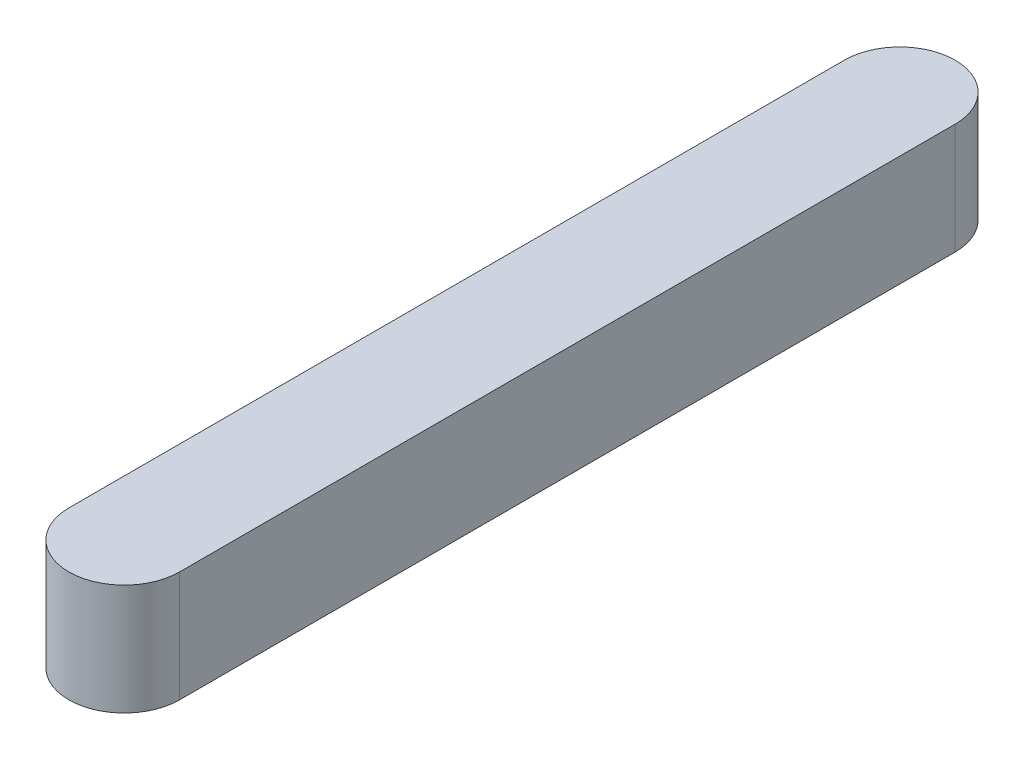
ISO-10303-21;
HEADER;
FILE_DESCRIPTION(('STEP AP214'),'2;1');
FILE_NAME('part.step','',(''),(''),'','','');
FILE_SCHEMA(('AUTOMOTIVE_DESIGN { 1 0 10303 214 1 1 1 1 }'));
ENDSEC;
DATA;
#1=APPLICATION_CONTEXT('core data for automotive mechanical design processes');
#2=APPLICATION_PROTOCOL_DEFINITION('international standard','automotive_design',2000,#1);
#3=PRODUCT_CONTEXT('',#1,'mechanical');
#4=PRODUCT('Part','Part','',(#3));
#5=PRODUCT_RELATED_PRODUCT_CATEGORY('part','',(#4));
#6=PRODUCT_DEFINITION_FORMATION('','',#4);
#7=PRODUCT_DEFINITION_CONTEXT('part definition',#1,'design');
#8=PRODUCT_DEFINITION('design','',#6,#7);
#9=PRODUCT_DEFINITION_SHAPE('','',#8);
#10=(LENGTH_UNIT() NAMED_UNIT(*) SI_UNIT(.MILLI.,.METRE.));
#11=(NAMED_UNIT(*) PLANE_ANGLE_UNIT() SI_UNIT($,.RADIAN.));
#12=(NAMED_UNIT(*) SI_UNIT($,.STERADIAN.) SOLID_ANGLE_UNIT());
#13=UNCERTAINTY_MEASURE_WITH_UNIT(LENGTH_MEASURE(1.E-05),#10,'distance_accuracy_value','');
#14=(GEOMETRIC_REPRESENTATION_CONTEXT(3) GLOBAL_UNCERTAINTY_ASSIGNED_CONTEXT((#13)) GLOBAL_UNIT_ASSIGNED_CONTEXT((#10,
#11,#12)) REPRESENTATION_CONTEXT('',''));
#15=CARTESIAN_POINT('',(0.,0.,0.));
#16=DIRECTION('',(0.,0.,1.));
#17=DIRECTION('',(1.,0.,0.));
#18=AXIS2_PLACEMENT_3D('',#15,#16,#17);
#19=CARTESIAN_POINT('',(0.,-2.5,17.5));
#20=DIRECTION('',(0.,1.,0.));
#21=DIRECTION('',(0.,0.,1.));
#22=AXIS2_PLACEMENT_3D('',#19,#20,#21);
#23=CYLINDRICAL_SURFACE('',#22,2.5);
#24=CARTESIAN_POINT('',(0.,2.5,17.5));
#25=DIRECTION('',(0.,1.,0.));
#26=DIRECTION('',(0.,0.,1.));
#27=AXIS2_PLACEMENT_3D('',#24,#25,#26);
#28=CIRCLE('',#27,2.5);
#29=CARTESIAN_POINT('',(-2.5,2.5,17.5));
#30=VERTEX_POINT('',#29);
#31=CARTESIAN_POINT('',(2.5,2.5,17.5));
#32=VERTEX_POINT('',#31);
#33=EDGE_CURVE('E103',#30,#32,#28,.T.);
#34=ORIENTED_EDGE('',*,*,#33,.F.);
#35=DIRECTION('',(0.,1.,0.));
#36=VECTOR('',#35,1.);
#37=CARTESIAN_POINT('',(-2.5,-2.5,17.5));
#38=LINE('',#37,#36);
#39=CARTESIAN_POINT('',(-2.5,-2.5,17.5));
#40=VERTEX_POINT('',#39);
#41=EDGE_CURVE('E11',#40,#30,#38,.T.);
#42=ORIENTED_EDGE('',*,*,#41,.F.);
#43=CARTESIAN_POINT('',(0.,-2.5,17.5));
#44=DIRECTION('',(0.,1.,0.));
#45=DIRECTION('',(0.,0.,1.));
#46=AXIS2_PLACEMENT_3D('',#43,#44,#45);
#47=CIRCLE('',#46,2.5);
#48=CARTESIAN_POINT('',(2.5,-2.5,17.5));
#49=VERTEX_POINT('',#48);
#50=EDGE_CURVE('E97',#40,#49,#47,.T.);
#51=ORIENTED_EDGE('',*,*,#50,.T.);
#52=DIRECTION('',(0.,1.,0.));
#53=VECTOR('',#52,1.);
#54=CARTESIAN_POINT('',(2.5,-2.5,17.5));
#55=LINE('',#54,#53);
#56=EDGE_CURVE('E42',#49,#32,#55,.T.);
#57=ORIENTED_EDGE('',*,*,#56,.T.);
#58=EDGE_LOOP('',(#34,#42,#51,#57));
#59=FACE_BOUND('',#58,.T.);
#60=ADVANCED_FACE('F39',(#59),#23,.T.);
#61=CARTESIAN_POINT('',(-2.5,-2.5,17.5));
#62=DIRECTION('',(-1.,0.,0.));
#63=DIRECTION('',(0.,0.,1.));
#64=AXIS2_PLACEMENT_3D('',#61,#62,#63);
#65=PLANE('',#64);
#66=DIRECTION('',(0.,0.,1.));
#67=VECTOR('',#66,1.);
#68=CARTESIAN_POINT('',(-2.5,2.5,17.5));
#69=LINE('',#68,#67);
#70=CARTESIAN_POINT('',(-2.5,2.5,-17.5));
#71=VERTEX_POINT('',#70);
#72=EDGE_CURVE('E99',#71,#30,#69,.T.);
#73=ORIENTED_EDGE('',*,*,#72,.F.);
#74=DIRECTION('',(0.,1.,0.));
#75=VECTOR('',#74,1.);
#76=CARTESIAN_POINT('',(-2.5,-2.5,-17.5));
#77=LINE('',#76,#75);
#78=CARTESIAN_POINT('',(-2.5,-2.5,-17.5));
#79=VERTEX_POINT('',#78);
#80=EDGE_CURVE('E48',#79,#71,#77,.T.);
#81=ORIENTED_EDGE('',*,*,#80,.F.);
#82=DIRECTION('',(0.,0.,1.));
#83=VECTOR('',#82,1.);
#84=CARTESIAN_POINT('',(-2.5,-2.5,17.5));
#85=LINE('',#84,#83);
#86=EDGE_CURVE('E94',#79,#40,#85,.T.);
#87=ORIENTED_EDGE('',*,*,#86,.T.);
#88=ORIENTED_EDGE('',*,*,#41,.T.);
#89=EDGE_LOOP('',(#73,#81,#87,#88));
#90=FACE_BOUND('',#89,.T.);
#91=ADVANCED_FACE('F113',(#90),#65,.T.);
#92=CARTESIAN_POINT('',(0.,-2.5,-17.5));
#93=DIRECTION('',(0.,1.,0.));
#94=DIRECTION('',(0.,0.,1.));
#95=AXIS2_PLACEMENT_3D('',#92,#93,#94);
#96=CYLINDRICAL_SURFACE('',#95,2.5);
#97=CARTESIAN_POINT('',(0.,2.5,-17.5));
#98=DIRECTION('',(0.,1.,0.));
#99=DIRECTION('',(0.,0.,1.));
#100=AXIS2_PLACEMENT_3D('',#97,#98,#99);
#101=CIRCLE('',#100,2.5);
#102=CARTESIAN_POINT('',(2.5,2.5,-17.5));
#103=VERTEX_POINT('',#102);
#104=EDGE_CURVE('E89',#103,#71,#101,.T.);
#105=ORIENTED_EDGE('',*,*,#104,.F.);
#106=DIRECTION('',(0.,1.,0.));
#107=VECTOR('',#106,1.);
#108=CARTESIAN_POINT('',(2.5,-2.5,-17.5));
#109=LINE('',#108,#107);
#110=CARTESIAN_POINT('',(2.5,-2.5,-17.5));
#111=VERTEX_POINT('',#110);
#112=EDGE_CURVE('E84',#111,#103,#109,.T.);
#113=ORIENTED_EDGE('',*,*,#112,.F.);
#114=CARTESIAN_POINT('',(0.,-2.5,-17.5));
#115=DIRECTION('',(0.,1.,0.));
#116=DIRECTION('',(0.,0.,1.));
#117=AXIS2_PLACEMENT_3D('',#114,#115,#116);
#118=CIRCLE('',#117,2.5);
#119=EDGE_CURVE('E87',#111,#79,#118,.T.);
#120=ORIENTED_EDGE('',*,*,#119,.T.);
#121=ORIENTED_EDGE('',*,*,#80,.T.);
#122=EDGE_LOOP('',(#105,#113,#120,#121));
#123=FACE_BOUND('',#122,.T.);
#124=ADVANCED_FACE('F86',(#123),#96,.T.);
#125=CARTESIAN_POINT('',(2.5,-2.5,17.5));
#126=DIRECTION('',(1.,0.,0.));
#127=DIRECTION('',(0.,0.,-1.));
#128=AXIS2_PLACEMENT_3D('',#125,#126,#127);
#129=PLANE('',#128);
#130=DIRECTION('',(0.,0.,-1.));
#131=VECTOR('',#130,1.);
#132=CARTESIAN_POINT('',(2.5,2.5,17.5));
#133=LINE('',#132,#131);
#134=EDGE_CURVE('E106',#32,#103,#133,.T.);
#135=ORIENTED_EDGE('',*,*,#134,.F.);
#136=ORIENTED_EDGE('',*,*,#56,.F.);
#137=DIRECTION('',(0.,0.,-1.));
#138=VECTOR('',#137,1.);
#139=CARTESIAN_POINT('',(2.5,-2.5,17.5));
#140=LINE('',#139,#138);
#141=EDGE_CURVE('E93',#49,#111,#140,.T.);
#142=ORIENTED_EDGE('',*,*,#141,.T.);
#143=ORIENTED_EDGE('',*,*,#112,.T.);
#144=EDGE_LOOP('',(#135,#136,#142,#143));
#145=FACE_BOUND('',#144,.T.);
#146=ADVANCED_FACE('F96',(#145),#129,.T.);
#147=CARTESIAN_POINT('',(0.,-2.5,17.5));
#148=DIRECTION('',(0.,1.,0.));
#149=DIRECTION('',(0.,0.,1.));
#150=AXIS2_PLACEMENT_3D('',#147,#148,#149);
#151=PLANE('',#150);
#152=ORIENTED_EDGE('',*,*,#50,.F.);
#153=ORIENTED_EDGE('',*,*,#86,.F.);
#154=ORIENTED_EDGE('',*,*,#119,.F.);
#155=ORIENTED_EDGE('',*,*,#141,.F.);
#156=EDGE_LOOP('',(#152,#153,#154,#155));
#157=FACE_BOUND('',#156,.T.);
#158=ADVANCED_FACE('F92',(#157),#151,.F.);
#159=CARTESIAN_POINT('',(0.,2.5,17.5));
#160=DIRECTION('',(0.,1.,0.));
#161=DIRECTION('',(0.,0.,1.));
#162=AXIS2_PLACEMENT_3D('',#159,#160,#161);
#163=PLANE('',#162);
#164=ORIENTED_EDGE('',*,*,#33,.T.);
#165=ORIENTED_EDGE('',*,*,#134,.T.);
#166=ORIENTED_EDGE('',*,*,#104,.T.);
#167=ORIENTED_EDGE('',*,*,#72,.T.);
#168=EDGE_LOOP('',(#164,#165,#166,#167));
#169=FACE_BOUND('',#168,.T.);
#170=ADVANCED_FACE('F112',(#169),#163,.T.);
#171=CLOSED_SHELL('',(#60,#91,#124,#146,#158,#170));
#172=MANIFOLD_SOLID_BREP('B2',#171);
#173=ADVANCED_BREP_SHAPE_REPRESENTATION('',(#18,#172),#14);
#174=SHAPE_DEFINITION_REPRESENTATION(#9,#173);
ENDSEC;
END-ISO-10303-21;
